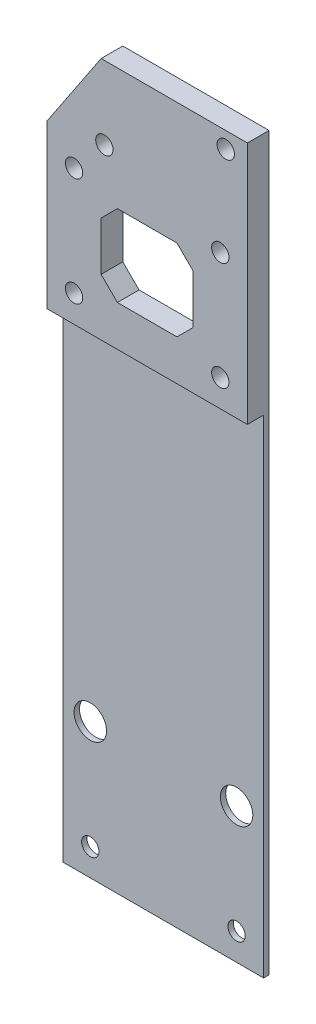
ISO-10303-21;
HEADER;
FILE_DESCRIPTION(('STEP AP214'),'2;1');
FILE_NAME('part.step','',(''),(''),'','','');
FILE_SCHEMA(('AUTOMOTIVE_DESIGN { 1 0 10303 214 1 1 1 1 }'));
ENDSEC;
DATA;
#1=APPLICATION_CONTEXT('core data for automotive mechanical design processes');
#2=APPLICATION_PROTOCOL_DEFINITION('international standard','automotive_design',2000,#1);
#3=PRODUCT_CONTEXT('',#1,'mechanical');
#4=PRODUCT('Part','Part','',(#3));
#5=PRODUCT_RELATED_PRODUCT_CATEGORY('part','',(#4));
#6=PRODUCT_DEFINITION_FORMATION('','',#4);
#7=PRODUCT_DEFINITION_CONTEXT('part definition',#1,'design');
#8=PRODUCT_DEFINITION('design','',#6,#7);
#9=PRODUCT_DEFINITION_SHAPE('','',#8);
#10=(LENGTH_UNIT() NAMED_UNIT(*) SI_UNIT(.MILLI.,.METRE.));
#11=(NAMED_UNIT(*) PLANE_ANGLE_UNIT() SI_UNIT($,.RADIAN.));
#12=(NAMED_UNIT(*) SI_UNIT($,.STERADIAN.) SOLID_ANGLE_UNIT());
#13=UNCERTAINTY_MEASURE_WITH_UNIT(LENGTH_MEASURE(1.E-05),#10,'distance_accuracy_value','');
#14=(GEOMETRIC_REPRESENTATION_CONTEXT(3) GLOBAL_UNCERTAINTY_ASSIGNED_CONTEXT((#13)) GLOBAL_UNIT_ASSIGNED_CONTEXT((#10,
#11,#12)) REPRESENTATION_CONTEXT('',''));
#15=CARTESIAN_POINT('',(0.,0.,0.));
#16=DIRECTION('',(0.,0.,1.));
#17=DIRECTION('',(1.,0.,0.));
#18=AXIS2_PLACEMENT_3D('',#15,#16,#17);
#19=CARTESIAN_POINT('',(0.,-60.,4.));
#20=DIRECTION('',(0.,1.,0.));
#21=DIRECTION('',(0.,0.,1.));
#22=AXIS2_PLACEMENT_3D('',#19,#20,#21);
#23=PLANE('',#22);
#24=DIRECTION('',(0.,0.,-1.));
#25=VECTOR('',#24,1.);
#26=CARTESIAN_POINT('',(18.5,-60.,4.));
#27=LINE('',#26,#25);
#28=CARTESIAN_POINT('',(18.5,-60.,1.));
#29=VERTEX_POINT('',#28);
#30=CARTESIAN_POINT('',(18.5,-60.,0.));
#31=VERTEX_POINT('',#30);
#32=EDGE_CURVE('E153',#29,#31,#27,.T.);
#33=ORIENTED_EDGE('',*,*,#32,.F.);
#34=DIRECTION('',(1.,0.,0.));
#35=VECTOR('',#34,1.);
#36=CARTESIAN_POINT('',(-18.5,-60.,1.));
#37=LINE('',#36,#35);
#38=CARTESIAN_POINT('',(-18.5,-60.,1.));
#39=VERTEX_POINT('',#38);
#40=EDGE_CURVE('E205',#39,#29,#37,.T.);
#41=ORIENTED_EDGE('',*,*,#40,.F.);
#42=DIRECTION('',(0.,0.,-1.));
#43=VECTOR('',#42,1.);
#44=CARTESIAN_POINT('',(-18.5,-60.,4.));
#45=LINE('',#44,#43);
#46=CARTESIAN_POINT('',(-18.5,-60.,0.));
#47=VERTEX_POINT('',#46);
#48=EDGE_CURVE('E247',#39,#47,#45,.T.);
#49=ORIENTED_EDGE('',*,*,#48,.T.);
#50=DIRECTION('',(1.,0.,0.));
#51=VECTOR('',#50,1.);
#52=CARTESIAN_POINT('',(0.,-60.,0.));
#53=LINE('',#52,#51);
#54=EDGE_CURVE('E158',#47,#31,#53,.T.);
#55=ORIENTED_EDGE('',*,*,#54,.T.);
#56=EDGE_LOOP('',(#33,#41,#49,#55));
#57=FACE_BOUND('',#56,.T.);
#58=ADVANCED_FACE('F37',(#57),#23,.F.);
#59=CARTESIAN_POINT('',(18.5,0.,4.));
#60=DIRECTION('',(-1.,0.,0.));
#61=DIRECTION('',(0.,0.,1.));
#62=AXIS2_PLACEMENT_3D('',#59,#60,#61);
#63=PLANE('',#62);
#64=DIRECTION('',(0.,1.,0.));
#65=VECTOR('',#64,1.);
#66=CARTESIAN_POINT('',(18.5,0.,4.));
#67=LINE('',#66,#65);
#68=CARTESIAN_POINT('',(18.5,30.,4.));
#69=VERTEX_POINT('',#68);
#70=CARTESIAN_POINT('',(18.5,75.,4.));
#71=VERTEX_POINT('',#70);
#72=EDGE_CURVE('E243',#69,#71,#67,.T.);
#73=ORIENTED_EDGE('',*,*,#72,.F.);
#74=DIRECTION('',(0.,0.,1.));
#75=VECTOR('',#74,1.);
#76=CARTESIAN_POINT('',(18.5,30.,1.));
#77=LINE('',#76,#75);
#78=CARTESIAN_POINT('',(18.5,30.,1.));
#79=VERTEX_POINT('',#78);
#80=EDGE_CURVE('E212',#79,#69,#77,.T.);
#81=ORIENTED_EDGE('',*,*,#80,.F.);
#82=DIRECTION('',(0.,1.,0.));
#83=VECTOR('',#82,1.);
#84=CARTESIAN_POINT('',(18.5,-60.,1.));
#85=LINE('',#84,#83);
#86=EDGE_CURVE('E207',#29,#79,#85,.T.);
#87=ORIENTED_EDGE('',*,*,#86,.F.);
#88=ORIENTED_EDGE('',*,*,#32,.T.);
#89=DIRECTION('',(0.,1.,0.));
#90=VECTOR('',#89,1.);
#91=CARTESIAN_POINT('',(18.5,0.,0.));
#92=LINE('',#91,#90);
#93=CARTESIAN_POINT('',(18.5,75.,0.));
#94=VERTEX_POINT('',#93);
#95=EDGE_CURVE('E145',#31,#94,#92,.T.);
#96=ORIENTED_EDGE('',*,*,#95,.T.);
#97=DIRECTION('',(0.,0.,1.));
#98=VECTOR('',#97,1.);
#99=CARTESIAN_POINT('',(18.5,75.,0.));
#100=LINE('',#99,#98);
#101=EDGE_CURVE('E150',#94,#71,#100,.T.);
#102=ORIENTED_EDGE('',*,*,#101,.T.);
#103=EDGE_LOOP('',(#73,#81,#87,#88,#96,#102));
#104=FACE_BOUND('',#103,.T.);
#105=ADVANCED_FACE('F148',(#104),#63,.F.);
#106=CARTESIAN_POINT('',(-13.5,55.,4.));
#107=DIRECTION('',(0.,0.,-1.));
#108=DIRECTION('',(-1.,0.,0.));
#109=AXIS2_PLACEMENT_3D('',#106,#107,#108);
#110=CYLINDRICAL_SURFACE('',#109,1.6);
#111=CARTESIAN_POINT('',(-13.5,55.,4.));
#112=DIRECTION('',(0.,0.,1.));
#113=DIRECTION('',(1.,0.,0.));
#114=AXIS2_PLACEMENT_3D('',#111,#112,#113);
#115=CIRCLE('',#114,1.6);
#116=CARTESIAN_POINT('',(-11.9,55.,4.));
#117=VERTEX_POINT('',#116);
#118=EDGE_CURVE('E240',#117,#117,#115,.T.);
#119=ORIENTED_EDGE('',*,*,#118,.T.);
#120=EDGE_LOOP('',(#119));
#121=FACE_BOUND('',#120,.T.);
#122=CARTESIAN_POINT('',(-13.5,55.,0.));
#123=DIRECTION('',(0.,0.,1.));
#124=DIRECTION('',(1.,0.,0.));
#125=AXIS2_PLACEMENT_3D('',#122,#123,#124);
#126=CIRCLE('',#125,1.6);
#127=CARTESIAN_POINT('',(-11.9,55.,0.));
#128=VERTEX_POINT('',#127);
#129=EDGE_CURVE('E268',#128,#128,#126,.T.);
#130=ORIENTED_EDGE('',*,*,#129,.F.);
#131=EDGE_LOOP('',(#130));
#132=FACE_BOUND('',#131,.T.);
#133=ADVANCED_FACE('F358',(#121,#132),#110,.F.);
#134=CARTESIAN_POINT('',(-13.5,35.,4.));
#135=DIRECTION('',(0.,0.,-1.));
#136=DIRECTION('',(-1.,0.,0.));
#137=AXIS2_PLACEMENT_3D('',#134,#135,#136);
#138=CYLINDRICAL_SURFACE('',#137,1.6);
#139=CARTESIAN_POINT('',(-13.5,35.,4.));
#140=DIRECTION('',(0.,0.,1.));
#141=DIRECTION('',(1.,0.,0.));
#142=AXIS2_PLACEMENT_3D('',#139,#140,#141);
#143=CIRCLE('',#142,1.6);
#144=CARTESIAN_POINT('',(-11.9,35.,4.));
#145=VERTEX_POINT('',#144);
#146=EDGE_CURVE('E237',#145,#145,#143,.T.);
#147=ORIENTED_EDGE('',*,*,#146,.T.);
#148=EDGE_LOOP('',(#147));
#149=FACE_BOUND('',#148,.T.);
#150=CARTESIAN_POINT('',(-13.5,35.,0.));
#151=DIRECTION('',(0.,0.,1.));
#152=DIRECTION('',(1.,0.,0.));
#153=AXIS2_PLACEMENT_3D('',#150,#151,#152);
#154=CIRCLE('',#153,1.6);
#155=CARTESIAN_POINT('',(-11.9,35.,0.));
#156=VERTEX_POINT('',#155);
#157=EDGE_CURVE('E265',#156,#156,#154,.T.);
#158=ORIENTED_EDGE('',*,*,#157,.F.);
#159=EDGE_LOOP('',(#158));
#160=FACE_BOUND('',#159,.T.);
#161=ADVANCED_FACE('F364',(#149,#160),#138,.F.);
#162=CARTESIAN_POINT('',(13.5,55.,4.));
#163=DIRECTION('',(0.,0.,-1.));
#164=DIRECTION('',(-1.,0.,0.));
#165=AXIS2_PLACEMENT_3D('',#162,#163,#164);
#166=CYLINDRICAL_SURFACE('',#165,1.6);
#167=CARTESIAN_POINT('',(13.5,55.,4.));
#168=DIRECTION('',(0.,0.,1.));
#169=DIRECTION('',(1.,0.,0.));
#170=AXIS2_PLACEMENT_3D('',#167,#168,#169);
#171=CIRCLE('',#170,1.6);
#172=CARTESIAN_POINT('',(15.1,55.,4.));
#173=VERTEX_POINT('',#172);
#174=EDGE_CURVE('E234',#173,#173,#171,.T.);
#175=ORIENTED_EDGE('',*,*,#174,.T.);
#176=EDGE_LOOP('',(#175));
#177=FACE_BOUND('',#176,.T.);
#178=CARTESIAN_POINT('',(13.5,55.,0.));
#179=DIRECTION('',(0.,0.,1.));
#180=DIRECTION('',(1.,0.,0.));
#181=AXIS2_PLACEMENT_3D('',#178,#179,#180);
#182=CIRCLE('',#181,1.6);
#183=CARTESIAN_POINT('',(15.1,55.,0.));
#184=VERTEX_POINT('',#183);
#185=EDGE_CURVE('E262',#184,#184,#182,.T.);
#186=ORIENTED_EDGE('',*,*,#185,.F.);
#187=EDGE_LOOP('',(#186));
#188=FACE_BOUND('',#187,.T.);
#189=ADVANCED_FACE('F368',(#177,#188),#166,.F.);
#190=CARTESIAN_POINT('',(13.5,35.,4.));
#191=DIRECTION('',(0.,0.,-1.));
#192=DIRECTION('',(-1.,0.,0.));
#193=AXIS2_PLACEMENT_3D('',#190,#191,#192);
#194=CYLINDRICAL_SURFACE('',#193,1.6);
#195=CARTESIAN_POINT('',(13.5,35.,4.));
#196=DIRECTION('',(0.,0.,1.));
#197=DIRECTION('',(1.,0.,0.));
#198=AXIS2_PLACEMENT_3D('',#195,#196,#197);
#199=CIRCLE('',#198,1.6);
#200=CARTESIAN_POINT('',(15.1,35.,4.));
#201=VERTEX_POINT('',#200);
#202=EDGE_CURVE('E231',#201,#201,#199,.T.);
#203=ORIENTED_EDGE('',*,*,#202,.T.);
#204=EDGE_LOOP('',(#203));
#205=FACE_BOUND('',#204,.T.);
#206=CARTESIAN_POINT('',(13.5,35.,0.));
#207=DIRECTION('',(0.,0.,1.));
#208=DIRECTION('',(1.,0.,0.));
#209=AXIS2_PLACEMENT_3D('',#206,#207,#208);
#210=CIRCLE('',#209,1.6);
#211=CARTESIAN_POINT('',(15.1,35.,0.));
#212=VERTEX_POINT('',#211);
#213=EDGE_CURVE('E259',#212,#212,#210,.T.);
#214=ORIENTED_EDGE('',*,*,#213,.F.);
#215=EDGE_LOOP('',(#214));
#216=FACE_BOUND('',#215,.T.);
#217=ADVANCED_FACE('F372',(#205,#216),#194,.F.);
#218=CARTESIAN_POINT('',(-13.5,-35.,4.));
#219=DIRECTION('',(0.,0.,-1.));
#220=DIRECTION('',(-1.,0.,0.));
#221=AXIS2_PLACEMENT_3D('',#218,#219,#220);
#222=CYLINDRICAL_SURFACE('',#221,3.);
#223=CARTESIAN_POINT('',(-13.5,-35.,1.));
#224=DIRECTION('',(0.,0.,-1.));
#225=DIRECTION('',(-1.,0.,0.));
#226=AXIS2_PLACEMENT_3D('',#223,#224,#225);
#227=CIRCLE('',#226,3.);
#228=CARTESIAN_POINT('',(-16.5,-35.,1.));
#229=VERTEX_POINT('',#228);
#230=EDGE_CURVE('E227',#229,#229,#227,.T.);
#231=ORIENTED_EDGE('',*,*,#230,.F.);
#232=EDGE_LOOP('',(#231));
#233=FACE_BOUND('',#232,.T.);
#234=CARTESIAN_POINT('',(-13.5,-35.,0.));
#235=DIRECTION('',(0.,0.,1.));
#236=DIRECTION('',(1.,0.,0.));
#237=AXIS2_PLACEMENT_3D('',#234,#235,#236);
#238=CIRCLE('',#237,3.);
#239=CARTESIAN_POINT('',(-10.5,-35.,0.));
#240=VERTEX_POINT('',#239);
#241=EDGE_CURVE('E256',#240,#240,#238,.T.);
#242=ORIENTED_EDGE('',*,*,#241,.F.);
#243=EDGE_LOOP('',(#242));
#244=FACE_BOUND('',#243,.T.);
#245=ADVANCED_FACE('F376',(#233,#244),#222,.F.);
#246=CARTESIAN_POINT('',(-13.5,-55.,4.));
#247=DIRECTION('',(0.,0.,-1.));
#248=DIRECTION('',(-1.,0.,0.));
#249=AXIS2_PLACEMENT_3D('',#246,#247,#248);
#250=CYLINDRICAL_SURFACE('',#249,1.6);
#251=CARTESIAN_POINT('',(-13.5,-55.,1.));
#252=DIRECTION('',(0.,0.,-1.));
#253=DIRECTION('',(-1.,0.,0.));
#254=AXIS2_PLACEMENT_3D('',#251,#252,#253);
#255=CIRCLE('',#254,1.6);
#256=CARTESIAN_POINT('',(-15.1,-55.,1.));
#257=VERTEX_POINT('',#256);
#258=EDGE_CURVE('E224',#257,#257,#255,.T.);
#259=ORIENTED_EDGE('',*,*,#258,.F.);
#260=EDGE_LOOP('',(#259));
#261=FACE_BOUND('',#260,.T.);
#262=CARTESIAN_POINT('',(-13.5,-55.,0.));
#263=DIRECTION('',(0.,0.,1.));
#264=DIRECTION('',(1.,0.,0.));
#265=AXIS2_PLACEMENT_3D('',#262,#263,#264);
#266=CIRCLE('',#265,1.6);
#267=CARTESIAN_POINT('',(-11.9,-55.,0.));
#268=VERTEX_POINT('',#267);
#269=EDGE_CURVE('E253',#268,#268,#266,.T.);
#270=ORIENTED_EDGE('',*,*,#269,.F.);
#271=EDGE_LOOP('',(#270));
#272=FACE_BOUND('',#271,.T.);
#273=ADVANCED_FACE('F380',(#261,#272),#250,.F.);
#274=CARTESIAN_POINT('',(13.5,-35.,4.));
#275=DIRECTION('',(0.,0.,-1.));
#276=DIRECTION('',(-1.,0.,0.));
#277=AXIS2_PLACEMENT_3D('',#274,#275,#276);
#278=CYLINDRICAL_SURFACE('',#277,3.);
#279=CARTESIAN_POINT('',(13.5,-35.,1.));
#280=DIRECTION('',(0.,0.,-1.));
#281=DIRECTION('',(-1.,0.,0.));
#282=AXIS2_PLACEMENT_3D('',#279,#280,#281);
#283=CIRCLE('',#282,3.);
#284=CARTESIAN_POINT('',(10.5,-35.,1.));
#285=VERTEX_POINT('',#284);
#286=EDGE_CURVE('E221',#285,#285,#283,.T.);
#287=ORIENTED_EDGE('',*,*,#286,.F.);
#288=EDGE_LOOP('',(#287));
#289=FACE_BOUND('',#288,.T.);
#290=CARTESIAN_POINT('',(13.5,-35.,0.));
#291=DIRECTION('',(0.,0.,1.));
#292=DIRECTION('',(1.,0.,0.));
#293=AXIS2_PLACEMENT_3D('',#290,#291,#292);
#294=CIRCLE('',#293,3.);
#295=CARTESIAN_POINT('',(16.5,-35.,0.));
#296=VERTEX_POINT('',#295);
#297=EDGE_CURVE('E250',#296,#296,#294,.T.);
#298=ORIENTED_EDGE('',*,*,#297,.F.);
#299=EDGE_LOOP('',(#298));
#300=FACE_BOUND('',#299,.T.);
#301=ADVANCED_FACE('F384',(#289,#300),#278,.F.);
#302=CARTESIAN_POINT('',(13.5,-55.,4.));
#303=DIRECTION('',(0.,0.,-1.));
#304=DIRECTION('',(-1.,0.,0.));
#305=AXIS2_PLACEMENT_3D('',#302,#303,#304);
#306=CYLINDRICAL_SURFACE('',#305,1.6);
#307=CARTESIAN_POINT('',(13.5,-55.,1.));
#308=DIRECTION('',(0.,0.,-1.));
#309=DIRECTION('',(-1.,0.,0.));
#310=AXIS2_PLACEMENT_3D('',#307,#308,#309);
#311=CIRCLE('',#310,1.6);
#312=CARTESIAN_POINT('',(11.9,-55.,1.));
#313=VERTEX_POINT('',#312);
#314=EDGE_CURVE('E217',#313,#313,#311,.T.);
#315=ORIENTED_EDGE('',*,*,#314,.F.);
#316=EDGE_LOOP('',(#315));
#317=FACE_BOUND('',#316,.T.);
#318=CARTESIAN_POINT('',(13.5,-55.,0.));
#319=DIRECTION('',(0.,0.,1.));
#320=DIRECTION('',(1.,0.,0.));
#321=AXIS2_PLACEMENT_3D('',#318,#319,#320);
#322=CIRCLE('',#321,1.6);
#323=CARTESIAN_POINT('',(15.1,-55.,0.));
#324=VERTEX_POINT('',#323);
#325=EDGE_CURVE('E230',#324,#324,#322,.T.);
#326=ORIENTED_EDGE('',*,*,#325,.F.);
#327=EDGE_LOOP('',(#326));
#328=FACE_BOUND('',#327,.T.);
#329=ADVANCED_FACE('F387',(#317,#328),#306,.F.);
#330=CARTESIAN_POINT('',(-18.5,0.,4.));
#331=DIRECTION('',(-1.,0.,0.));
#332=DIRECTION('',(0.,0.,1.));
#333=AXIS2_PLACEMENT_3D('',#330,#331,#332);
#334=PLANE('',#333);
#335=DIRECTION('',(0.,0.,1.));
#336=VECTOR('',#335,1.);
#337=CARTESIAN_POINT('',(-18.5,30.,1.));
#338=LINE('',#337,#336);
#339=CARTESIAN_POINT('',(-18.5,30.,1.));
#340=VERTEX_POINT('',#339);
#341=CARTESIAN_POINT('',(-18.5,30.,4.));
#342=VERTEX_POINT('',#341);
#343=EDGE_CURVE('E214',#340,#342,#338,.T.);
#344=ORIENTED_EDGE('',*,*,#343,.T.);
#345=DIRECTION('',(0.,1.,0.));
#346=VECTOR('',#345,1.);
#347=CARTESIAN_POINT('',(-18.5,0.,4.));
#348=LINE('',#347,#346);
#349=CARTESIAN_POINT('',(-18.5,60.,4.));
#350=VERTEX_POINT('',#349);
#351=EDGE_CURVE('E245',#342,#350,#348,.T.);
#352=ORIENTED_EDGE('',*,*,#351,.T.);
#353=DIRECTION('',(0.,0.,-1.));
#354=VECTOR('',#353,1.);
#355=CARTESIAN_POINT('',(-18.5,60.,4.));
#356=LINE('',#355,#354);
#357=CARTESIAN_POINT('',(-18.5,60.,0.));
#358=VERTEX_POINT('',#357);
#359=EDGE_CURVE('E274',#350,#358,#356,.T.);
#360=ORIENTED_EDGE('',*,*,#359,.T.);
#361=DIRECTION('',(0.,1.,0.));
#362=VECTOR('',#361,1.);
#363=CARTESIAN_POINT('',(-18.5,0.,0.));
#364=LINE('',#363,#362);
#365=EDGE_CURVE('E157',#47,#358,#364,.T.);
#366=ORIENTED_EDGE('',*,*,#365,.F.);
#367=ORIENTED_EDGE('',*,*,#48,.F.);
#368=DIRECTION('',(0.,-1.,0.));
#369=VECTOR('',#368,1.);
#370=CARTESIAN_POINT('',(-18.5,-60.,1.));
#371=LINE('',#370,#369);
#372=EDGE_CURVE('E203',#340,#39,#371,.T.);
#373=ORIENTED_EDGE('',*,*,#372,.F.);
#374=EDGE_LOOP('',(#344,#352,#360,#366,#367,#373));
#375=FACE_BOUND('',#374,.T.);
#376=ADVANCED_FACE('F390',(#375),#334,.T.);
#377=CARTESIAN_POINT('',(0.,0.,4.));
#378=DIRECTION('',(0.,0.,1.));
#379=DIRECTION('',(1.,0.,0.));
#380=AXIS2_PLACEMENT_3D('',#377,#378,#379);
#381=PLANE('',#380);
#382=CARTESIAN_POINT('',(14.5,72.,4.));
#383=DIRECTION('',(0.,0.,1.));
#384=DIRECTION('',(1.,0.,0.));
#385=AXIS2_PLACEMENT_3D('',#382,#383,#384);
#386=CIRCLE('',#385,1.60000000000001);
#387=CARTESIAN_POINT('',(16.1,72.,4.));
#388=VERTEX_POINT('',#387);
#389=EDGE_CURVE('E465',#388,#388,#386,.T.);
#390=ORIENTED_EDGE('',*,*,#389,.F.);
#391=EDGE_LOOP('',(#390));
#392=FACE_BOUND('',#391,.T.);
#393=CARTESIAN_POINT('',(-7.9,61.5,4.));
#394=DIRECTION('',(0.,0.,1.));
#395=DIRECTION('',(1.,0.,0.));
#396=AXIS2_PLACEMENT_3D('',#393,#394,#395);
#397=CIRCLE('',#396,1.59999999999999);
#398=CARTESIAN_POINT('',(-6.30000000000001,61.5,4.));
#399=VERTEX_POINT('',#398);
#400=EDGE_CURVE('E470',#399,#399,#397,.T.);
#401=ORIENTED_EDGE('',*,*,#400,.F.);
#402=EDGE_LOOP('',(#401));
#403=FACE_BOUND('',#402,.T.);
#404=DIRECTION('',(1.,0.,0.));
#405=VECTOR('',#404,1.);
#406=CARTESIAN_POINT('',(8.50000000000001,52.5,4.));
#407=LINE('',#406,#405);
#408=CARTESIAN_POINT('',(-5.5,52.5,4.));
#409=VERTEX_POINT('',#408);
#410=CARTESIAN_POINT('',(5.5,52.5,4.));
#411=VERTEX_POINT('',#410);
#412=EDGE_CURVE('E191',#409,#411,#407,.T.);
#413=ORIENTED_EDGE('',*,*,#412,.T.);
#414=DIRECTION('',(-0.707106781186541,0.707106781186554,0.));
#415=VECTOR('',#414,1.);
#416=CARTESIAN_POINT('',(8.5,49.4999999999999,4.));
#417=LINE('',#416,#415);
#418=CARTESIAN_POINT('',(8.5,49.4999999999999,4.));
#419=VERTEX_POINT('',#418);
#420=EDGE_CURVE('E306',#411,#419,#417,.F.);
#421=ORIENTED_EDGE('',*,*,#420,.T.);
#422=DIRECTION('',(0.,-1.,0.));
#423=VECTOR('',#422,1.);
#424=CARTESIAN_POINT('',(8.50000000000001,52.5,4.));
#425=LINE('',#424,#423);
#426=CARTESIAN_POINT('',(8.5,40.5,4.));
#427=VERTEX_POINT('',#426);
#428=EDGE_CURVE('E182',#419,#427,#425,.T.);
#429=ORIENTED_EDGE('',*,*,#428,.T.);
#430=DIRECTION('',(0.707106781186551,0.707106781186544,0.));
#431=VECTOR('',#430,1.);
#432=CARTESIAN_POINT('',(5.49999999999996,37.5,4.));
#433=LINE('',#432,#431);
#434=CARTESIAN_POINT('',(5.49999999999996,37.5,4.));
#435=VERTEX_POINT('',#434);
#436=EDGE_CURVE('E302',#427,#435,#433,.F.);
#437=ORIENTED_EDGE('',*,*,#436,.T.);
#438=DIRECTION('',(-1.,0.,0.));
#439=VECTOR('',#438,1.);
#440=CARTESIAN_POINT('',(8.5,37.5,4.));
#441=LINE('',#440,#439);
#442=CARTESIAN_POINT('',(-5.5,37.5,4.));
#443=VERTEX_POINT('',#442);
#444=EDGE_CURVE('E185',#435,#443,#441,.T.);
#445=ORIENTED_EDGE('',*,*,#444,.T.);
#446=DIRECTION('',(0.707106781186541,-0.707106781186554,0.));
#447=VECTOR('',#446,1.);
#448=CARTESIAN_POINT('',(-8.5,40.5,4.));
#449=LINE('',#448,#447);
#450=CARTESIAN_POINT('',(-8.5,40.5,4.));
#451=VERTEX_POINT('',#450);
#452=EDGE_CURVE('E298',#443,#451,#449,.F.);
#453=ORIENTED_EDGE('',*,*,#452,.T.);
#454=DIRECTION('',(0.,1.,0.));
#455=VECTOR('',#454,1.);
#456=CARTESIAN_POINT('',(-8.49999999999999,52.5,4.));
#457=LINE('',#456,#455);
#458=CARTESIAN_POINT('',(-8.5,49.5,4.));
#459=VERTEX_POINT('',#458);
#460=EDGE_CURVE('E189',#451,#459,#457,.T.);
#461=ORIENTED_EDGE('',*,*,#460,.T.);
#462=DIRECTION('',(-0.707106781186551,-0.707106781186544,0.));
#463=VECTOR('',#462,1.);
#464=CARTESIAN_POINT('',(-5.49999999999999,52.5,4.));
#465=LINE('',#464,#463);
#466=EDGE_CURVE('E11',#459,#409,#465,.F.);
#467=ORIENTED_EDGE('',*,*,#466,.T.);
#468=EDGE_LOOP('',(#413,#421,#429,#437,#445,#453,#461,#467));
#469=FACE_BOUND('',#468,.T.);
#470=DIRECTION('',(-1.,0.,0.));
#471=VECTOR('',#470,1.);
#472=CARTESIAN_POINT('',(-18.5,30.,4.));
#473=LINE('',#472,#471);
#474=EDGE_CURVE('E193',#69,#342,#473,.T.);
#475=ORIENTED_EDGE('',*,*,#474,.F.);
#476=ORIENTED_EDGE('',*,*,#72,.T.);
#477=DIRECTION('',(1.,0.,0.));
#478=VECTOR('',#477,1.);
#479=CARTESIAN_POINT('',(0.,75.,4.));
#480=LINE('',#479,#478);
#481=CARTESIAN_POINT('',(-8.49999999999999,75.,4.));
#482=VERTEX_POINT('',#481);
#483=EDGE_CURVE('E174',#482,#71,#480,.T.);
#484=ORIENTED_EDGE('',*,*,#483,.F.);
#485=DIRECTION('',(0.554700196225229,0.832050294337844,0.));
#486=VECTOR('',#485,1.);
#487=CARTESIAN_POINT('',(-40.5,27.,4.));
#488=LINE('',#487,#486);
#489=EDGE_CURVE('E169',#350,#482,#488,.T.);
#490=ORIENTED_EDGE('',*,*,#489,.F.);
#491=ORIENTED_EDGE('',*,*,#351,.F.);
#492=EDGE_LOOP('',(#475,#476,#484,#490,#491));
#493=FACE_BOUND('',#492,.T.);
#494=ORIENTED_EDGE('',*,*,#202,.F.);
#495=EDGE_LOOP('',(#494));
#496=FACE_BOUND('',#495,.T.);
#497=ORIENTED_EDGE('',*,*,#174,.F.);
#498=EDGE_LOOP('',(#497));
#499=FACE_BOUND('',#498,.T.);
#500=ORIENTED_EDGE('',*,*,#146,.F.);
#501=EDGE_LOOP('',(#500));
#502=FACE_BOUND('',#501,.T.);
#503=ORIENTED_EDGE('',*,*,#118,.F.);
#504=EDGE_LOOP('',(#503));
#505=FACE_BOUND('',#504,.T.);
#506=ADVANCED_FACE('F321',(#392,#403,#469,#493,#496,#499,#502,#505),#381,.T.);
#507=CARTESIAN_POINT('',(0.,0.,0.));
#508=DIRECTION('',(0.,0.,1.));
#509=DIRECTION('',(1.,0.,0.));
#510=AXIS2_PLACEMENT_3D('',#507,#508,#509);
#511=PLANE('',#510);
#512=CARTESIAN_POINT('',(14.5,72.,0.));
#513=DIRECTION('',(0.,0.,1.));
#514=DIRECTION('',(1.,0.,0.));
#515=AXIS2_PLACEMENT_3D('',#512,#513,#514);
#516=CIRCLE('',#515,1.60000000000001);
#517=CARTESIAN_POINT('',(16.1,72.,0.));
#518=VERTEX_POINT('',#517);
#519=EDGE_CURVE('E462',#518,#518,#516,.T.);
#520=ORIENTED_EDGE('',*,*,#519,.T.);
#521=EDGE_LOOP('',(#520));
#522=FACE_BOUND('',#521,.T.);
#523=CARTESIAN_POINT('',(-7.9,61.5,0.));
#524=DIRECTION('',(0.,0.,1.));
#525=DIRECTION('',(1.,0.,0.));
#526=AXIS2_PLACEMENT_3D('',#523,#524,#525);
#527=CIRCLE('',#526,1.59999999999999);
#528=CARTESIAN_POINT('',(-6.30000000000001,61.5,0.));
#529=VERTEX_POINT('',#528);
#530=EDGE_CURVE('E466',#529,#529,#527,.T.);
#531=ORIENTED_EDGE('',*,*,#530,.T.);
#532=EDGE_LOOP('',(#531));
#533=FACE_BOUND('',#532,.T.);
#534=DIRECTION('',(-1.,0.,0.));
#535=VECTOR('',#534,1.);
#536=CARTESIAN_POINT('',(8.5,37.5,0.));
#537=LINE('',#536,#535);
#538=CARTESIAN_POINT('',(5.49999999999996,37.5,0.));
#539=VERTEX_POINT('',#538);
#540=CARTESIAN_POINT('',(-5.5,37.5,0.));
#541=VERTEX_POINT('',#540);
#542=EDGE_CURVE('E196',#539,#541,#537,.T.);
#543=ORIENTED_EDGE('',*,*,#542,.F.);
#544=DIRECTION('',(-0.707106781186551,-0.707106781186544,0.));
#545=VECTOR('',#544,1.);
#546=CARTESIAN_POINT('',(-16.,16.0000000000002,0.));
#547=LINE('',#546,#545);
#548=CARTESIAN_POINT('',(8.5,40.5,0.));
#549=VERTEX_POINT('',#548);
#550=EDGE_CURVE('E300',#539,#549,#547,.F.);
#551=ORIENTED_EDGE('',*,*,#550,.T.);
#552=DIRECTION('',(0.,-1.,0.));
#553=VECTOR('',#552,1.);
#554=CARTESIAN_POINT('',(8.50000000000001,52.5,0.));
#555=LINE('',#554,#553);
#556=CARTESIAN_POINT('',(8.5,49.4999999999999,0.));
#557=VERTEX_POINT('',#556);
#558=EDGE_CURVE('E177',#557,#549,#555,.T.);
#559=ORIENTED_EDGE('',*,*,#558,.F.);
#560=DIRECTION('',(0.707106781186541,-0.707106781186554,0.));
#561=VECTOR('',#560,1.);
#562=CARTESIAN_POINT('',(29.,28.9999999999995,0.));
#563=LINE('',#562,#561);
#564=CARTESIAN_POINT('',(5.5,52.5,0.));
#565=VERTEX_POINT('',#564);
#566=EDGE_CURVE('E304',#557,#565,#563,.F.);
#567=ORIENTED_EDGE('',*,*,#566,.T.);
#568=DIRECTION('',(1.,0.,0.));
#569=VECTOR('',#568,1.);
#570=CARTESIAN_POINT('',(8.50000000000001,52.5,0.));
#571=LINE('',#570,#569);
#572=CARTESIAN_POINT('',(-5.5,52.5,0.));
#573=VERTEX_POINT('',#572);
#574=EDGE_CURVE('E186',#573,#565,#571,.T.);
#575=ORIENTED_EDGE('',*,*,#574,.F.);
#576=DIRECTION('',(0.707106781186551,0.707106781186544,0.));
#577=VECTOR('',#576,1.);
#578=CARTESIAN_POINT('',(-29.,29.0000000000003,0.));
#579=LINE('',#578,#577);
#580=CARTESIAN_POINT('',(-8.5,49.5,0.));
#581=VERTEX_POINT('',#580);
#582=EDGE_CURVE('E46',#573,#581,#579,.F.);
#583=ORIENTED_EDGE('',*,*,#582,.T.);
#584=DIRECTION('',(0.,1.,0.));
#585=VECTOR('',#584,1.);
#586=CARTESIAN_POINT('',(-8.49999999999999,52.5,0.));
#587=LINE('',#586,#585);
#588=CARTESIAN_POINT('',(-8.5,40.5,0.));
#589=VERTEX_POINT('',#588);
#590=EDGE_CURVE('E199',#589,#581,#587,.T.);
#591=ORIENTED_EDGE('',*,*,#590,.F.);
#592=DIRECTION('',(-0.707106781186541,0.707106781186554,0.));
#593=VECTOR('',#592,1.);
#594=CARTESIAN_POINT('',(15.9999999999999,15.9999999999996,0.));
#595=LINE('',#594,#593);
#596=EDGE_CURVE('E296',#589,#541,#595,.F.);
#597=ORIENTED_EDGE('',*,*,#596,.T.);
#598=EDGE_LOOP('',(#543,#551,#559,#567,#575,#583,#591,#597));
#599=FACE_BOUND('',#598,.T.);
#600=ORIENTED_EDGE('',*,*,#325,.T.);
#601=EDGE_LOOP('',(#600));
#602=FACE_BOUND('',#601,.T.);
#603=ORIENTED_EDGE('',*,*,#297,.T.);
#604=EDGE_LOOP('',(#603));
#605=FACE_BOUND('',#604,.T.);
#606=ORIENTED_EDGE('',*,*,#269,.T.);
#607=EDGE_LOOP('',(#606));
#608=FACE_BOUND('',#607,.T.);
#609=ORIENTED_EDGE('',*,*,#241,.T.);
#610=EDGE_LOOP('',(#609));
#611=FACE_BOUND('',#610,.T.);
#612=ORIENTED_EDGE('',*,*,#213,.T.);
#613=EDGE_LOOP('',(#612));
#614=FACE_BOUND('',#613,.T.);
#615=ORIENTED_EDGE('',*,*,#185,.T.);
#616=EDGE_LOOP('',(#615));
#617=FACE_BOUND('',#616,.T.);
#618=ORIENTED_EDGE('',*,*,#157,.T.);
#619=EDGE_LOOP('',(#618));
#620=FACE_BOUND('',#619,.T.);
#621=ORIENTED_EDGE('',*,*,#129,.T.);
#622=EDGE_LOOP('',(#621));
#623=FACE_BOUND('',#622,.T.);
#624=ORIENTED_EDGE('',*,*,#54,.F.);
#625=ORIENTED_EDGE('',*,*,#365,.T.);
#626=DIRECTION('',(0.554700196225229,0.832050294337844,0.));
#627=VECTOR('',#626,1.);
#628=CARTESIAN_POINT('',(-40.5,27.,0.));
#629=LINE('',#628,#627);
#630=CARTESIAN_POINT('',(-8.49999999999999,75.,0.));
#631=VERTEX_POINT('',#630);
#632=EDGE_CURVE('E165',#358,#631,#629,.T.);
#633=ORIENTED_EDGE('',*,*,#632,.T.);
#634=DIRECTION('',(1.,0.,0.));
#635=VECTOR('',#634,1.);
#636=CARTESIAN_POINT('',(0.,75.,0.));
#637=LINE('',#636,#635);
#638=EDGE_CURVE('E161',#631,#94,#637,.T.);
#639=ORIENTED_EDGE('',*,*,#638,.T.);
#640=ORIENTED_EDGE('',*,*,#95,.F.);
#641=EDGE_LOOP('',(#624,#625,#633,#639,#640));
#642=FACE_BOUND('',#641,.T.);
#643=ADVANCED_FACE('F162',(#522,#533,#599,#602,#605,#608,#611,#614,#617,#620,#623,#642),#511,.F.);
#644=CARTESIAN_POINT('',(-18.5,30.,1.));
#645=DIRECTION('',(0.,1.,0.));
#646=DIRECTION('',(0.,0.,1.));
#647=AXIS2_PLACEMENT_3D('',#644,#645,#646);
#648=PLANE('',#647);
#649=ORIENTED_EDGE('',*,*,#474,.T.);
#650=ORIENTED_EDGE('',*,*,#343,.F.);
#651=DIRECTION('',(-1.,0.,0.));
#652=VECTOR('',#651,1.);
#653=CARTESIAN_POINT('',(-18.5,30.,1.));
#654=LINE('',#653,#652);
#655=EDGE_CURVE('E209',#79,#340,#654,.T.);
#656=ORIENTED_EDGE('',*,*,#655,.F.);
#657=ORIENTED_EDGE('',*,*,#80,.T.);
#658=EDGE_LOOP('',(#649,#650,#656,#657));
#659=FACE_BOUND('',#658,.T.);
#660=ADVANCED_FACE('F401',(#659),#648,.F.);
#661=CARTESIAN_POINT('',(0.,0.,1.));
#662=DIRECTION('',(0.,0.,-1.));
#663=DIRECTION('',(-1.,0.,0.));
#664=AXIS2_PLACEMENT_3D('',#661,#662,#663);
#665=PLANE('',#664);
#666=ORIENTED_EDGE('',*,*,#230,.T.);
#667=EDGE_LOOP('',(#666));
#668=FACE_BOUND('',#667,.T.);
#669=ORIENTED_EDGE('',*,*,#258,.T.);
#670=EDGE_LOOP('',(#669));
#671=FACE_BOUND('',#670,.T.);
#672=ORIENTED_EDGE('',*,*,#286,.T.);
#673=EDGE_LOOP('',(#672));
#674=FACE_BOUND('',#673,.T.);
#675=ORIENTED_EDGE('',*,*,#314,.T.);
#676=EDGE_LOOP('',(#675));
#677=FACE_BOUND('',#676,.T.);
#678=ORIENTED_EDGE('',*,*,#372,.T.);
#679=ORIENTED_EDGE('',*,*,#40,.T.);
#680=ORIENTED_EDGE('',*,*,#86,.T.);
#681=ORIENTED_EDGE('',*,*,#655,.T.);
#682=EDGE_LOOP('',(#678,#679,#680,#681));
#683=FACE_BOUND('',#682,.T.);
#684=ADVANCED_FACE('F428',(#668,#671,#674,#677,#683),#665,.F.);
#685=CARTESIAN_POINT('',(8.50000000000001,52.5,4.));
#686=DIRECTION('',(1.,0.,0.));
#687=DIRECTION('',(0.,1.,0.));
#688=AXIS2_PLACEMENT_3D('',#685,#686,#687);
#689=PLANE('',#688);
#690=ORIENTED_EDGE('',*,*,#558,.T.);
#691=DIRECTION('',(0.,0.,1.));
#692=VECTOR('',#691,1.);
#693=CARTESIAN_POINT('',(8.5,40.5,4.));
#694=LINE('',#693,#692);
#695=EDGE_CURVE('E290',#549,#427,#694,.T.);
#696=ORIENTED_EDGE('',*,*,#695,.T.);
#697=ORIENTED_EDGE('',*,*,#428,.F.);
#698=DIRECTION('',(0.,0.,-1.));
#699=VECTOR('',#698,1.);
#700=CARTESIAN_POINT('',(8.5,49.4999999999999,0.));
#701=LINE('',#700,#699);
#702=EDGE_CURVE('E287',#419,#557,#701,.T.);
#703=ORIENTED_EDGE('',*,*,#702,.T.);
#704=EDGE_LOOP('',(#690,#696,#697,#703));
#705=FACE_BOUND('',#704,.T.);
#706=ADVANCED_FACE('F329',(#705),#689,.F.);
#707=CARTESIAN_POINT('',(8.50000000000001,52.5,4.));
#708=DIRECTION('',(0.,1.,0.));
#709=DIRECTION('',(-1.,0.,0.));
#710=AXIS2_PLACEMENT_3D('',#707,#708,#709);
#711=PLANE('',#710);
#712=ORIENTED_EDGE('',*,*,#574,.T.);
#713=DIRECTION('',(0.,0.,1.));
#714=VECTOR('',#713,1.);
#715=CARTESIAN_POINT('',(5.5,52.5,4.));
#716=LINE('',#715,#714);
#717=EDGE_CURVE('E53',#565,#411,#716,.T.);
#718=ORIENTED_EDGE('',*,*,#717,.T.);
#719=ORIENTED_EDGE('',*,*,#412,.F.);
#720=DIRECTION('',(0.,0.,-1.));
#721=VECTOR('',#720,1.);
#722=CARTESIAN_POINT('',(-5.5,52.5,0.));
#723=LINE('',#722,#721);
#724=EDGE_CURVE('E292',#409,#573,#723,.T.);
#725=ORIENTED_EDGE('',*,*,#724,.T.);
#726=EDGE_LOOP('',(#712,#718,#719,#725));
#727=FACE_BOUND('',#726,.T.);
#728=ADVANCED_FACE('F319',(#727),#711,.F.);
#729=CARTESIAN_POINT('',(-8.49999999999999,52.5,4.));
#730=DIRECTION('',(-1.,0.,0.));
#731=DIRECTION('',(0.,-1.,0.));
#732=AXIS2_PLACEMENT_3D('',#729,#730,#731);
#733=PLANE('',#732);
#734=ORIENTED_EDGE('',*,*,#460,.F.);
#735=DIRECTION('',(0.,0.,-1.));
#736=VECTOR('',#735,1.);
#737=CARTESIAN_POINT('',(-8.5,40.5,0.));
#738=LINE('',#737,#736);
#739=EDGE_CURVE('E279',#451,#589,#738,.T.);
#740=ORIENTED_EDGE('',*,*,#739,.T.);
#741=ORIENTED_EDGE('',*,*,#590,.T.);
#742=DIRECTION('',(0.,0.,1.));
#743=VECTOR('',#742,1.);
#744=CARTESIAN_POINT('',(-8.5,49.5,4.));
#745=LINE('',#744,#743);
#746=EDGE_CURVE('E277',#581,#459,#745,.T.);
#747=ORIENTED_EDGE('',*,*,#746,.T.);
#748=EDGE_LOOP('',(#734,#740,#741,#747));
#749=FACE_BOUND('',#748,.T.);
#750=ADVANCED_FACE('F317',(#749),#733,.F.);
#751=CARTESIAN_POINT('',(8.5,37.5,4.));
#752=DIRECTION('',(0.,-1.,0.));
#753=DIRECTION('',(0.,0.,-1.));
#754=AXIS2_PLACEMENT_3D('',#751,#752,#753);
#755=PLANE('',#754);
#756=ORIENTED_EDGE('',*,*,#542,.T.);
#757=DIRECTION('',(0.,0.,1.));
#758=VECTOR('',#757,1.);
#759=CARTESIAN_POINT('',(-5.5,37.5,4.));
#760=LINE('',#759,#758);
#761=EDGE_CURVE('E285',#541,#443,#760,.T.);
#762=ORIENTED_EDGE('',*,*,#761,.T.);
#763=ORIENTED_EDGE('',*,*,#444,.F.);
#764=DIRECTION('',(0.,0.,-1.));
#765=VECTOR('',#764,1.);
#766=CARTESIAN_POINT('',(5.49999999999996,37.5,0.));
#767=LINE('',#766,#765);
#768=EDGE_CURVE('E282',#435,#539,#767,.T.);
#769=ORIENTED_EDGE('',*,*,#768,.T.);
#770=EDGE_LOOP('',(#756,#762,#763,#769));
#771=FACE_BOUND('',#770,.T.);
#772=ADVANCED_FACE('F337',(#771),#755,.F.);
#773=CARTESIAN_POINT('',(-8.5,40.5,4.));
#774=DIRECTION('',(0.707106781186554,0.707106781186541,0.));
#775=DIRECTION('',(0.,0.,1.));
#776=AXIS2_PLACEMENT_3D('',#773,#774,#775);
#777=PLANE('',#776);
#778=ORIENTED_EDGE('',*,*,#452,.F.);
#779=ORIENTED_EDGE('',*,*,#761,.F.);
#780=ORIENTED_EDGE('',*,*,#596,.F.);
#781=ORIENTED_EDGE('',*,*,#739,.F.);
#782=EDGE_LOOP('',(#778,#779,#780,#781));
#783=FACE_BOUND('',#782,.T.);
#784=ADVANCED_FACE('F341',(#783),#777,.T.);
#785=CARTESIAN_POINT('',(5.49999999999996,37.5,4.));
#786=DIRECTION('',(-0.707106781186544,0.707106781186551,0.));
#787=DIRECTION('',(0.,0.,1.));
#788=AXIS2_PLACEMENT_3D('',#785,#786,#787);
#789=PLANE('',#788);
#790=ORIENTED_EDGE('',*,*,#436,.F.);
#791=ORIENTED_EDGE('',*,*,#695,.F.);
#792=ORIENTED_EDGE('',*,*,#550,.F.);
#793=ORIENTED_EDGE('',*,*,#768,.F.);
#794=EDGE_LOOP('',(#790,#791,#792,#793));
#795=FACE_BOUND('',#794,.T.);
#796=ADVANCED_FACE('F334',(#795),#789,.T.);
#797=CARTESIAN_POINT('',(8.5,49.4999999999999,4.));
#798=DIRECTION('',(-0.707106781186554,-0.707106781186541,0.));
#799=DIRECTION('',(0.,0.,1.));
#800=AXIS2_PLACEMENT_3D('',#797,#798,#799);
#801=PLANE('',#800);
#802=ORIENTED_EDGE('',*,*,#420,.F.);
#803=ORIENTED_EDGE('',*,*,#717,.F.);
#804=ORIENTED_EDGE('',*,*,#566,.F.);
#805=ORIENTED_EDGE('',*,*,#702,.F.);
#806=EDGE_LOOP('',(#802,#803,#804,#805));
#807=FACE_BOUND('',#806,.T.);
#808=ADVANCED_FACE('F326',(#807),#801,.T.);
#809=CARTESIAN_POINT('',(-5.49999999999999,52.5,4.));
#810=DIRECTION('',(0.707106781186544,-0.707106781186551,0.));
#811=DIRECTION('',(0.,0.,1.));
#812=AXIS2_PLACEMENT_3D('',#809,#810,#811);
#813=PLANE('',#812);
#814=ORIENTED_EDGE('',*,*,#466,.F.);
#815=ORIENTED_EDGE('',*,*,#746,.F.);
#816=ORIENTED_EDGE('',*,*,#582,.F.);
#817=ORIENTED_EDGE('',*,*,#724,.F.);
#818=EDGE_LOOP('',(#814,#815,#816,#817));
#819=FACE_BOUND('',#818,.T.);
#820=ADVANCED_FACE('F40',(#819),#813,.T.);
#821=CARTESIAN_POINT('',(-40.5,27.,0.));
#822=DIRECTION('',(0.832050294337844,-0.554700196225229,0.));
#823=DIRECTION('',(0.554700196225229,0.832050294337844,0.));
#824=AXIS2_PLACEMENT_3D('',#821,#822,#823);
#825=PLANE('',#824);
#826=ORIENTED_EDGE('',*,*,#489,.T.);
#827=DIRECTION('',(0.,0.,1.));
#828=VECTOR('',#827,1.);
#829=CARTESIAN_POINT('',(-8.49999999999999,75.,0.));
#830=LINE('',#829,#828);
#831=EDGE_CURVE('E175',#631,#482,#830,.T.);
#832=ORIENTED_EDGE('',*,*,#831,.F.);
#833=ORIENTED_EDGE('',*,*,#632,.F.);
#834=ORIENTED_EDGE('',*,*,#359,.F.);
#835=EDGE_LOOP('',(#826,#832,#833,#834));
#836=FACE_BOUND('',#835,.T.);
#837=ADVANCED_FACE('F448',(#836),#825,.F.);
#838=CARTESIAN_POINT('',(0.,75.,0.));
#839=DIRECTION('',(0.,-1.,0.));
#840=DIRECTION('',(0.,0.,-1.));
#841=AXIS2_PLACEMENT_3D('',#838,#839,#840);
#842=PLANE('',#841);
#843=ORIENTED_EDGE('',*,*,#483,.T.);
#844=ORIENTED_EDGE('',*,*,#101,.F.);
#845=ORIENTED_EDGE('',*,*,#638,.F.);
#846=ORIENTED_EDGE('',*,*,#831,.T.);
#847=EDGE_LOOP('',(#843,#844,#845,#846));
#848=FACE_BOUND('',#847,.T.);
#849=ADVANCED_FACE('F172',(#848),#842,.F.);
#850=CARTESIAN_POINT('',(-7.9,61.5,0.));
#851=DIRECTION('',(0.,0.,1.));
#852=DIRECTION('',(1.,0.,0.));
#853=AXIS2_PLACEMENT_3D('',#850,#851,#852);
#854=CYLINDRICAL_SURFACE('',#853,1.59999999999999);
#855=ORIENTED_EDGE('',*,*,#530,.F.);
#856=EDGE_LOOP('',(#855));
#857=FACE_BOUND('',#856,.T.);
#858=ORIENTED_EDGE('',*,*,#400,.T.);
#859=EDGE_LOOP('',(#858));
#860=FACE_BOUND('',#859,.T.);
#861=ADVANCED_FACE('F447',(#857,#860),#854,.F.);
#862=CARTESIAN_POINT('',(14.5,72.,0.));
#863=DIRECTION('',(0.,0.,1.));
#864=DIRECTION('',(1.,0.,0.));
#865=AXIS2_PLACEMENT_3D('',#862,#863,#864);
#866=CYLINDRICAL_SURFACE('',#865,1.60000000000001);
#867=ORIENTED_EDGE('',*,*,#519,.F.);
#868=EDGE_LOOP('',(#867));
#869=FACE_BOUND('',#868,.T.);
#870=ORIENTED_EDGE('',*,*,#389,.T.);
#871=EDGE_LOOP('',(#870));
#872=FACE_BOUND('',#871,.T.);
#873=ADVANCED_FACE('F454',(#869,#872),#866,.F.);
#874=CLOSED_SHELL('',(#58,#105,#133,#161,#189,#217,#245,#273,#301,#329,#376,#506,#643,#660,#684,
#706,#728,#750,#772,#784,#796,#808,#820,#837,#849,#861,#873));
#875=MANIFOLD_SOLID_BREP('B2',#874);
#876=ADVANCED_BREP_SHAPE_REPRESENTATION('',(#18,#875),#14);
#877=SHAPE_DEFINITION_REPRESENTATION(#9,#876);
ENDSEC;
END-ISO-10303-21;
